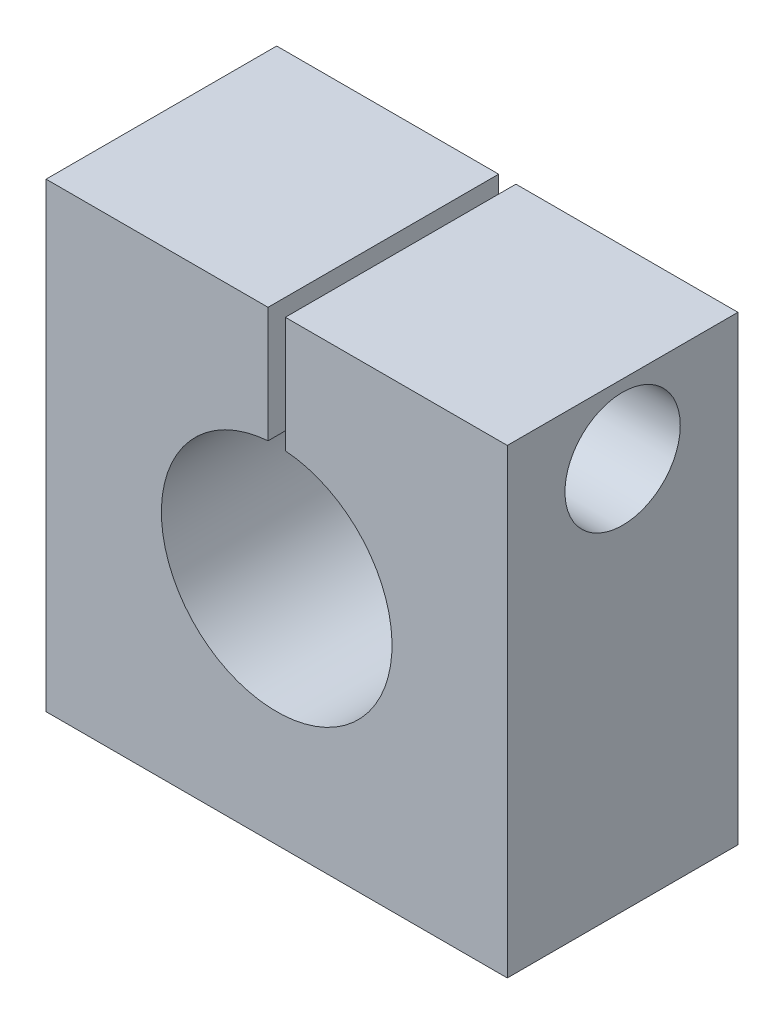
ISO-10303-21;
HEADER;
FILE_DESCRIPTION(('STEP AP214'),'2;1');
FILE_NAME('part.step','',(''),(''),'','','');
FILE_SCHEMA(('AUTOMOTIVE_DESIGN { 1 0 10303 214 1 1 1 1 }'));
ENDSEC;
DATA;
#1=APPLICATION_CONTEXT('core data for automotive mechanical design processes');
#2=APPLICATION_PROTOCOL_DEFINITION('international standard','automotive_design',2000,#1);
#3=PRODUCT_CONTEXT('',#1,'mechanical');
#4=PRODUCT('Part','Part','',(#3));
#5=PRODUCT_RELATED_PRODUCT_CATEGORY('part','',(#4));
#6=PRODUCT_DEFINITION_FORMATION('','',#4);
#7=PRODUCT_DEFINITION_CONTEXT('part definition',#1,'design');
#8=PRODUCT_DEFINITION('design','',#6,#7);
#9=PRODUCT_DEFINITION_SHAPE('','',#8);
#10=(LENGTH_UNIT() NAMED_UNIT(*) SI_UNIT(.MILLI.,.METRE.));
#11=(NAMED_UNIT(*) PLANE_ANGLE_UNIT() SI_UNIT($,.RADIAN.));
#12=(NAMED_UNIT(*) SI_UNIT($,.STERADIAN.) SOLID_ANGLE_UNIT());
#13=UNCERTAINTY_MEASURE_WITH_UNIT(LENGTH_MEASURE(1.E-05),#10,'distance_accuracy_value','');
#14=(GEOMETRIC_REPRESENTATION_CONTEXT(3) GLOBAL_UNCERTAINTY_ASSIGNED_CONTEXT((#13)) GLOBAL_UNIT_ASSIGNED_CONTEXT((#10,
#11,#12)) REPRESENTATION_CONTEXT('',''));
#15=CARTESIAN_POINT('',(0.,0.,0.));
#16=DIRECTION('',(0.,0.,1.));
#17=DIRECTION('',(1.,0.,0.));
#18=AXIS2_PLACEMENT_3D('',#15,#16,#17);
#19=CARTESIAN_POINT('',(-9.99999999999999,39.,10.));
#20=DIRECTION('',(1.,0.,0.));
#21=DIRECTION('',(0.,0.,-1.));
#22=AXIS2_PLACEMENT_3D('',#19,#20,#21);
#23=CYLINDRICAL_SURFACE('',#22,3.);
#24=CARTESIAN_POINT('',(0.750000000000001,39.,10.));
#25=DIRECTION('',(1.,0.,0.));
#26=DIRECTION('',(0.,1.,0.));
#27=AXIS2_PLACEMENT_3D('',#24,#25,#26);
#28=CIRCLE('',#27,3.);
#29=CARTESIAN_POINT('',(0.750000000000001,42.,10.));
#30=VERTEX_POINT('',#29);
#31=EDGE_CURVE('E137',#30,#30,#28,.T.);
#32=ORIENTED_EDGE('',*,*,#31,.F.);
#33=EDGE_LOOP('',(#32));
#34=FACE_BOUND('',#33,.T.);
#35=CARTESIAN_POINT('',(10.,39.,10.));
#36=DIRECTION('',(1.,0.,0.));
#37=DIRECTION('',(0.,0.,-1.));
#38=AXIS2_PLACEMENT_3D('',#35,#36,#37);
#39=CIRCLE('',#38,3.);
#40=CARTESIAN_POINT('',(10.,39.,7.));
#41=VERTEX_POINT('',#40);
#42=EDGE_CURVE('E39',#41,#41,#39,.F.);
#43=ORIENTED_EDGE('',*,*,#42,.F.);
#44=EDGE_LOOP('',(#43));
#45=FACE_BOUND('',#44,.T.);
#46=ADVANCED_FACE('F35',(#34,#45),#23,.F.);
#47=CARTESIAN_POINT('',(0.,25.,20.));
#48=DIRECTION('',(0.,0.,-1.));
#49=DIRECTION('',(-1.,0.,0.));
#50=AXIS2_PLACEMENT_3D('',#47,#48,#49);
#51=CYLINDRICAL_SURFACE('',#50,10.);
#52=CARTESIAN_POINT('',(0.,25.,0.));
#53=DIRECTION('',(0.,0.,1.));
#54=DIRECTION('',(1.,0.,0.));
#55=AXIS2_PLACEMENT_3D('',#52,#53,#54);
#56=CIRCLE('',#55,10.);
#57=CARTESIAN_POINT('',(-0.75,34.9718353375896,0.));
#58=VERTEX_POINT('',#57);
#59=CARTESIAN_POINT('',(0.75,34.9718353375896,0.));
#60=VERTEX_POINT('',#59);
#61=EDGE_CURVE('E144',#58,#60,#56,.T.);
#62=ORIENTED_EDGE('',*,*,#61,.F.);
#63=DIRECTION('',(0.,0.,-1.));
#64=VECTOR('',#63,1.);
#65=CARTESIAN_POINT('',(-0.75,34.9718353375896,20.));
#66=LINE('',#65,#64);
#67=CARTESIAN_POINT('',(-0.75,34.9718353375896,20.));
#68=VERTEX_POINT('',#67);
#69=EDGE_CURVE('E11',#68,#58,#66,.T.);
#70=ORIENTED_EDGE('',*,*,#69,.F.);
#71=CARTESIAN_POINT('',(0.,25.,20.));
#72=DIRECTION('',(0.,0.,1.));
#73=DIRECTION('',(1.,0.,0.));
#74=AXIS2_PLACEMENT_3D('',#71,#72,#73);
#75=CIRCLE('',#74,10.);
#76=CARTESIAN_POINT('',(0.75,34.9718353375896,20.));
#77=VERTEX_POINT('',#76);
#78=EDGE_CURVE('E156',#68,#77,#75,.T.);
#79=ORIENTED_EDGE('',*,*,#78,.T.);
#80=DIRECTION('',(0.,0.,-1.));
#81=VECTOR('',#80,1.);
#82=CARTESIAN_POINT('',(0.75,34.9718353375896,20.));
#83=LINE('',#82,#81);
#84=EDGE_CURVE('E87',#77,#60,#83,.T.);
#85=ORIENTED_EDGE('',*,*,#84,.T.);
#86=EDGE_LOOP('',(#62,#70,#79,#85));
#87=FACE_BOUND('',#86,.T.);
#88=ADVANCED_FACE('F37',(#87),#51,.F.);
#89=CARTESIAN_POINT('',(-0.749999999999999,0.,20.));
#90=DIRECTION('',(-1.,0.,0.));
#91=DIRECTION('',(0.,-1.,0.));
#92=AXIS2_PLACEMENT_3D('',#89,#90,#91);
#93=PLANE('',#92);
#94=CARTESIAN_POINT('',(-0.750000000000001,39.,10.));
#95=DIRECTION('',(-1.,0.,0.));
#96=DIRECTION('',(0.,-1.,0.));
#97=AXIS2_PLACEMENT_3D('',#94,#95,#96);
#98=CIRCLE('',#97,3.);
#99=CARTESIAN_POINT('',(-0.750000000000001,36.,10.));
#100=VERTEX_POINT('',#99);
#101=EDGE_CURVE('E139',#100,#100,#98,.T.);
#102=ORIENTED_EDGE('',*,*,#101,.T.);
#103=EDGE_LOOP('',(#102));
#104=FACE_BOUND('',#103,.T.);
#105=DIRECTION('',(0.,1.,0.));
#106=VECTOR('',#105,1.);
#107=CARTESIAN_POINT('',(-0.749999999999999,0.,0.));
#108=LINE('',#107,#106);
#109=CARTESIAN_POINT('',(-0.75,45.,0.));
#110=VERTEX_POINT('',#109);
#111=EDGE_CURVE('E169',#58,#110,#108,.T.);
#112=ORIENTED_EDGE('',*,*,#111,.T.);
#113=DIRECTION('',(0.,0.,-1.));
#114=VECTOR('',#113,1.);
#115=CARTESIAN_POINT('',(-0.75,45.,20.));
#116=LINE('',#115,#114);
#117=CARTESIAN_POINT('',(-0.75,45.,20.));
#118=VERTEX_POINT('',#117);
#119=EDGE_CURVE('E44',#118,#110,#116,.T.);
#120=ORIENTED_EDGE('',*,*,#119,.F.);
#121=DIRECTION('',(0.,1.,0.));
#122=VECTOR('',#121,1.);
#123=CARTESIAN_POINT('',(-0.749999999999999,0.,20.));
#124=LINE('',#123,#122);
#125=EDGE_CURVE('E158',#68,#118,#124,.T.);
#126=ORIENTED_EDGE('',*,*,#125,.F.);
#127=ORIENTED_EDGE('',*,*,#69,.T.);
#128=EDGE_LOOP('',(#112,#120,#126,#127));
#129=FACE_BOUND('',#128,.T.);
#130=ADVANCED_FACE('F187',(#104,#129),#93,.F.);
#131=CARTESIAN_POINT('',(0.,45.,20.));
#132=DIRECTION('',(0.,-1.,0.));
#133=DIRECTION('',(0.,0.,-1.));
#134=AXIS2_PLACEMENT_3D('',#131,#132,#133);
#135=PLANE('',#134);
#136=DIRECTION('',(-1.,0.,0.));
#137=VECTOR('',#136,1.);
#138=CARTESIAN_POINT('',(0.,45.,0.));
#139=LINE('',#138,#137);
#140=CARTESIAN_POINT('',(-20.,45.,0.));
#141=VERTEX_POINT('',#140);
#142=EDGE_CURVE('E172',#110,#141,#139,.T.);
#143=ORIENTED_EDGE('',*,*,#142,.T.);
#144=DIRECTION('',(0.,0.,-1.));
#145=VECTOR('',#144,1.);
#146=CARTESIAN_POINT('',(-20.,45.,20.));
#147=LINE('',#146,#145);
#148=CARTESIAN_POINT('',(-20.,45.,20.));
#149=VERTEX_POINT('',#148);
#150=EDGE_CURVE('E129',#149,#141,#147,.T.);
#151=ORIENTED_EDGE('',*,*,#150,.F.);
#152=DIRECTION('',(-1.,0.,0.));
#153=VECTOR('',#152,1.);
#154=CARTESIAN_POINT('',(0.,45.,20.));
#155=LINE('',#154,#153);
#156=EDGE_CURVE('E162',#118,#149,#155,.T.);
#157=ORIENTED_EDGE('',*,*,#156,.F.);
#158=ORIENTED_EDGE('',*,*,#119,.T.);
#159=EDGE_LOOP('',(#143,#151,#157,#158));
#160=FACE_BOUND('',#159,.T.);
#161=ADVANCED_FACE('F192',(#160),#135,.F.);
#162=CARTESIAN_POINT('',(-20.,0.,20.));
#163=DIRECTION('',(1.,0.,0.));
#164=DIRECTION('',(0.,0.,-1.));
#165=AXIS2_PLACEMENT_3D('',#162,#163,#164);
#166=PLANE('',#165);
#167=DIRECTION('',(0.,-1.,0.));
#168=VECTOR('',#167,1.);
#169=CARTESIAN_POINT('',(-20.,0.,0.));
#170=LINE('',#169,#168);
#171=CARTESIAN_POINT('',(-20.,4.99999999999999,0.));
#172=VERTEX_POINT('',#171);
#173=EDGE_CURVE('E175',#141,#172,#170,.T.);
#174=ORIENTED_EDGE('',*,*,#173,.T.);
#175=DIRECTION('',(0.,0.,1.));
#176=VECTOR('',#175,1.);
#177=CARTESIAN_POINT('',(-20.,4.99999999999999,0.));
#178=LINE('',#177,#176);
#179=CARTESIAN_POINT('',(-20.,4.99999999999999,20.));
#180=VERTEX_POINT('',#179);
#181=EDGE_CURVE('E52',#172,#180,#178,.T.);
#182=ORIENTED_EDGE('',*,*,#181,.T.);
#183=DIRECTION('',(0.,-1.,0.));
#184=VECTOR('',#183,1.);
#185=CARTESIAN_POINT('',(-20.,0.,20.));
#186=LINE('',#185,#184);
#187=EDGE_CURVE('E115',#149,#180,#186,.T.);
#188=ORIENTED_EDGE('',*,*,#187,.F.);
#189=ORIENTED_EDGE('',*,*,#150,.T.);
#190=EDGE_LOOP('',(#174,#182,#188,#189));
#191=FACE_BOUND('',#190,.T.);
#192=ADVANCED_FACE('F219',(#191),#166,.F.);
#193=CARTESIAN_POINT('',(20.,0.,20.));
#194=DIRECTION('',(-1.,0.,0.));
#195=DIRECTION('',(0.,0.,1.));
#196=AXIS2_PLACEMENT_3D('',#193,#194,#195);
#197=PLANE('',#196);
#198=CARTESIAN_POINT('',(20.,39.,10.));
#199=DIRECTION('',(1.,0.,0.));
#200=DIRECTION('',(0.,0.,-1.));
#201=AXIS2_PLACEMENT_3D('',#198,#199,#200);
#202=CIRCLE('',#201,5.);
#203=CARTESIAN_POINT('',(20.,39.,5.));
#204=VERTEX_POINT('',#203);
#205=EDGE_CURVE('E153',#204,#204,#202,.T.);
#206=ORIENTED_EDGE('',*,*,#205,.F.);
#207=EDGE_LOOP('',(#206));
#208=FACE_BOUND('',#207,.T.);
#209=DIRECTION('',(0.,1.,0.));
#210=VECTOR('',#209,1.);
#211=CARTESIAN_POINT('',(20.,0.,20.));
#212=LINE('',#211,#210);
#213=CARTESIAN_POINT('',(20.,4.99999999999999,20.));
#214=VERTEX_POINT('',#213);
#215=CARTESIAN_POINT('',(20.,45.,20.));
#216=VERTEX_POINT('',#215);
#217=EDGE_CURVE('E104',#214,#216,#212,.T.);
#218=ORIENTED_EDGE('',*,*,#217,.F.);
#219=DIRECTION('',(0.,0.,1.));
#220=VECTOR('',#219,1.);
#221=CARTESIAN_POINT('',(20.,4.99999999999999,0.));
#222=LINE('',#221,#220);
#223=CARTESIAN_POINT('',(20.,4.99999999999999,0.));
#224=VERTEX_POINT('',#223);
#225=EDGE_CURVE('E220',#224,#214,#222,.T.);
#226=ORIENTED_EDGE('',*,*,#225,.F.);
#227=DIRECTION('',(0.,1.,0.));
#228=VECTOR('',#227,1.);
#229=CARTESIAN_POINT('',(20.,0.,0.));
#230=LINE('',#229,#228);
#231=CARTESIAN_POINT('',(20.,45.,0.));
#232=VERTEX_POINT('',#231);
#233=EDGE_CURVE('E127',#224,#232,#230,.T.);
#234=ORIENTED_EDGE('',*,*,#233,.T.);
#235=DIRECTION('',(0.,0.,-1.));
#236=VECTOR('',#235,1.);
#237=CARTESIAN_POINT('',(20.,45.,20.));
#238=LINE('',#237,#236);
#239=EDGE_CURVE('E121',#216,#232,#238,.T.);
#240=ORIENTED_EDGE('',*,*,#239,.F.);
#241=EDGE_LOOP('',(#218,#226,#234,#240));
#242=FACE_BOUND('',#241,.T.);
#243=ADVANCED_FACE('F125',(#208,#242),#197,.F.);
#244=CARTESIAN_POINT('',(0.,45.,20.));
#245=DIRECTION('',(0.,-1.,0.));
#246=DIRECTION('',(0.,0.,-1.));
#247=AXIS2_PLACEMENT_3D('',#244,#245,#246);
#248=PLANE('',#247);
#249=DIRECTION('',(-1.,0.,0.));
#250=VECTOR('',#249,1.);
#251=CARTESIAN_POINT('',(0.,45.,0.));
#252=LINE('',#251,#250);
#253=CARTESIAN_POINT('',(0.75,45.,0.));
#254=VERTEX_POINT('',#253);
#255=EDGE_CURVE('E179',#232,#254,#252,.T.);
#256=ORIENTED_EDGE('',*,*,#255,.T.);
#257=DIRECTION('',(0.,0.,-1.));
#258=VECTOR('',#257,1.);
#259=CARTESIAN_POINT('',(0.75,45.,20.));
#260=LINE('',#259,#258);
#261=CARTESIAN_POINT('',(0.75,45.,20.));
#262=VERTEX_POINT('',#261);
#263=EDGE_CURVE('E123',#262,#254,#260,.T.);
#264=ORIENTED_EDGE('',*,*,#263,.F.);
#265=DIRECTION('',(-1.,0.,0.));
#266=VECTOR('',#265,1.);
#267=CARTESIAN_POINT('',(0.,45.,20.));
#268=LINE('',#267,#266);
#269=EDGE_CURVE('E107',#216,#262,#268,.T.);
#270=ORIENTED_EDGE('',*,*,#269,.F.);
#271=ORIENTED_EDGE('',*,*,#239,.T.);
#272=EDGE_LOOP('',(#256,#264,#270,#271));
#273=FACE_BOUND('',#272,.T.);
#274=ADVANCED_FACE('F120',(#273),#248,.F.);
#275=CARTESIAN_POINT('',(0.749999999999999,0.,20.));
#276=DIRECTION('',(1.,0.,0.));
#277=DIRECTION('',(0.,1.,0.));
#278=AXIS2_PLACEMENT_3D('',#275,#276,#277);
#279=PLANE('',#278);
#280=ORIENTED_EDGE('',*,*,#31,.T.);
#281=EDGE_LOOP('',(#280));
#282=FACE_BOUND('',#281,.T.);
#283=DIRECTION('',(0.,-1.,0.));
#284=VECTOR('',#283,1.);
#285=CARTESIAN_POINT('',(0.749999999999999,0.,0.));
#286=LINE('',#285,#284);
#287=EDGE_CURVE('E159',#254,#60,#286,.T.);
#288=ORIENTED_EDGE('',*,*,#287,.T.);
#289=ORIENTED_EDGE('',*,*,#84,.F.);
#290=DIRECTION('',(0.,-1.,0.));
#291=VECTOR('',#290,1.);
#292=CARTESIAN_POINT('',(0.749999999999999,0.,20.));
#293=LINE('',#292,#291);
#294=EDGE_CURVE('E61',#262,#77,#293,.T.);
#295=ORIENTED_EDGE('',*,*,#294,.F.);
#296=ORIENTED_EDGE('',*,*,#263,.T.);
#297=EDGE_LOOP('',(#288,#289,#295,#296));
#298=FACE_BOUND('',#297,.T.);
#299=ADVANCED_FACE('F182',(#282,#298),#279,.F.);
#300=CARTESIAN_POINT('',(0.,0.,20.));
#301=DIRECTION('',(0.,0.,1.));
#302=DIRECTION('',(1.,0.,0.));
#303=AXIS2_PLACEMENT_3D('',#300,#301,#302);
#304=PLANE('',#303);
#305=DIRECTION('',(-1.,0.,0.));
#306=VECTOR('',#305,1.);
#307=CARTESIAN_POINT('',(-20.,4.99999999999999,20.));
#308=LINE('',#307,#306);
#309=EDGE_CURVE('E111',#214,#180,#308,.T.);
#310=ORIENTED_EDGE('',*,*,#309,.F.);
#311=ORIENTED_EDGE('',*,*,#217,.T.);
#312=ORIENTED_EDGE('',*,*,#269,.T.);
#313=ORIENTED_EDGE('',*,*,#294,.T.);
#314=ORIENTED_EDGE('',*,*,#78,.F.);
#315=ORIENTED_EDGE('',*,*,#125,.T.);
#316=ORIENTED_EDGE('',*,*,#156,.T.);
#317=ORIENTED_EDGE('',*,*,#187,.T.);
#318=EDGE_LOOP('',(#310,#311,#312,#313,#314,#315,#316,#317));
#319=FACE_BOUND('',#318,.T.);
#320=ADVANCED_FACE('F106',(#319),#304,.T.);
#321=CARTESIAN_POINT('',(0.,0.,0.));
#322=DIRECTION('',(0.,0.,1.));
#323=DIRECTION('',(1.,0.,0.));
#324=AXIS2_PLACEMENT_3D('',#321,#322,#323);
#325=PLANE('',#324);
#326=ORIENTED_EDGE('',*,*,#233,.F.);
#327=DIRECTION('',(-1.,0.,0.));
#328=VECTOR('',#327,1.);
#329=CARTESIAN_POINT('',(-20.,4.99999999999999,0.));
#330=LINE('',#329,#328);
#331=EDGE_CURVE('E224',#224,#172,#330,.T.);
#332=ORIENTED_EDGE('',*,*,#331,.T.);
#333=ORIENTED_EDGE('',*,*,#173,.F.);
#334=ORIENTED_EDGE('',*,*,#142,.F.);
#335=ORIENTED_EDGE('',*,*,#111,.F.);
#336=ORIENTED_EDGE('',*,*,#61,.T.);
#337=ORIENTED_EDGE('',*,*,#287,.F.);
#338=ORIENTED_EDGE('',*,*,#255,.F.);
#339=EDGE_LOOP('',(#326,#332,#333,#334,#335,#336,#337,#338));
#340=FACE_BOUND('',#339,.T.);
#341=ADVANCED_FACE('F185',(#340),#325,.F.);
#342=CARTESIAN_POINT('',(-9.99999999999999,39.,10.));
#343=DIRECTION('',(1.,0.,0.));
#344=DIRECTION('',(0.,0.,-1.));
#345=AXIS2_PLACEMENT_3D('',#342,#343,#344);
#346=CIRCLE('',#345,3.);
#347=CARTESIAN_POINT('',(-9.99999999999999,39.,7.));
#348=VERTEX_POINT('',#347);
#349=EDGE_CURVE('E140',#348,#348,#346,.T.);
#350=ORIENTED_EDGE('',*,*,#349,.F.);
#351=EDGE_LOOP('',(#350));
#352=FACE_BOUND('',#351,.T.);
#353=ORIENTED_EDGE('',*,*,#101,.F.);
#354=EDGE_LOOP('',(#353));
#355=FACE_BOUND('',#354,.T.);
#356=ADVANCED_FACE('F196',(#352,#355),#23,.F.);
#357=CARTESIAN_POINT('',(-9.99999999999999,39.,10.));
#358=DIRECTION('',(1.,0.,0.));
#359=DIRECTION('',(0.,0.,-1.));
#360=AXIS2_PLACEMENT_3D('',#357,#358,#359);
#361=PLANE('',#360);
#362=ORIENTED_EDGE('',*,*,#349,.T.);
#363=EDGE_LOOP('',(#362));
#364=FACE_BOUND('',#363,.T.);
#365=ADVANCED_FACE('F203',(#364),#361,.T.);
#366=CARTESIAN_POINT('',(10.,39.,10.));
#367=DIRECTION('',(1.,0.,0.));
#368=DIRECTION('',(0.,0.,-1.));
#369=AXIS2_PLACEMENT_3D('',#366,#367,#368);
#370=PLANE('',#369);
#371=CARTESIAN_POINT('',(10.,39.,10.));
#372=DIRECTION('',(1.,0.,0.));
#373=DIRECTION('',(0.,0.,-1.));
#374=AXIS2_PLACEMENT_3D('',#371,#372,#373);
#375=CIRCLE('',#374,5.);
#376=CARTESIAN_POINT('',(10.,39.,5.));
#377=VERTEX_POINT('',#376);
#378=EDGE_CURVE('E151',#377,#377,#375,.T.);
#379=ORIENTED_EDGE('',*,*,#378,.T.);
#380=EDGE_LOOP('',(#379));
#381=FACE_BOUND('',#380,.T.);
#382=ORIENTED_EDGE('',*,*,#42,.T.);
#383=EDGE_LOOP('',(#382));
#384=FACE_BOUND('',#383,.T.);
#385=ADVANCED_FACE('F209',(#381,#384),#370,.T.);
#386=CARTESIAN_POINT('',(10.,39.,10.));
#387=DIRECTION('',(1.,0.,0.));
#388=DIRECTION('',(0.,0.,-1.));
#389=AXIS2_PLACEMENT_3D('',#386,#387,#388);
#390=CYLINDRICAL_SURFACE('',#389,5.);
#391=ORIENTED_EDGE('',*,*,#378,.F.);
#392=EDGE_LOOP('',(#391));
#393=FACE_BOUND('',#392,.T.);
#394=ORIENTED_EDGE('',*,*,#205,.T.);
#395=EDGE_LOOP('',(#394));
#396=FACE_BOUND('',#395,.T.);
#397=ADVANCED_FACE('F233',(#393,#396),#390,.F.);
#398=CARTESIAN_POINT('',(-20.,4.99999999999999,0.));
#399=DIRECTION('',(0.,1.,0.));
#400=DIRECTION('',(0.,0.,1.));
#401=AXIS2_PLACEMENT_3D('',#398,#399,#400);
#402=PLANE('',#401);
#403=CARTESIAN_POINT('',(10.,4.99999999999999,10.));
#404=DIRECTION('',(0.,-1.,0.));
#405=DIRECTION('',(0.,0.,-1.));
#406=AXIS2_PLACEMENT_3D('',#403,#404,#405);
#407=CIRCLE('',#406,4.);
#408=CARTESIAN_POINT('',(10.,4.99999999999999,6.));
#409=VERTEX_POINT('',#408);
#410=EDGE_CURVE('E369',#409,#409,#407,.T.);
#411=ORIENTED_EDGE('',*,*,#410,.F.);
#412=EDGE_LOOP('',(#411));
#413=FACE_BOUND('',#412,.T.);
#414=CARTESIAN_POINT('',(-10.,4.99999999999999,10.));
#415=DIRECTION('',(0.,-1.,0.));
#416=DIRECTION('',(0.,0.,-1.));
#417=AXIS2_PLACEMENT_3D('',#414,#415,#416);
#418=CIRCLE('',#417,4.);
#419=CARTESIAN_POINT('',(-10.,4.99999999999999,6.));
#420=VERTEX_POINT('',#419);
#421=EDGE_CURVE('E368',#420,#420,#418,.T.);
#422=ORIENTED_EDGE('',*,*,#421,.F.);
#423=EDGE_LOOP('',(#422));
#424=FACE_BOUND('',#423,.T.);
#425=ORIENTED_EDGE('',*,*,#309,.T.);
#426=ORIENTED_EDGE('',*,*,#181,.F.);
#427=ORIENTED_EDGE('',*,*,#331,.F.);
#428=ORIENTED_EDGE('',*,*,#225,.T.);
#429=EDGE_LOOP('',(#425,#426,#427,#428));
#430=FACE_BOUND('',#429,.T.);
#431=ADVANCED_FACE('F236',(#413,#424,#430),#402,.F.);
#432=CARTESIAN_POINT('',(-10.,15.,10.));
#433=DIRECTION('',(0.,-1.,0.));
#434=DIRECTION('',(0.,0.,-1.));
#435=AXIS2_PLACEMENT_3D('',#432,#433,#434);
#436=CYLINDRICAL_SURFACE('',#435,4.);
#437=CARTESIAN_POINT('',(-10.,15.,10.));
#438=DIRECTION('',(0.,-1.,0.));
#439=DIRECTION('',(0.,0.,-1.));
#440=AXIS2_PLACEMENT_3D('',#437,#438,#439);
#441=CIRCLE('',#440,4.);
#442=CARTESIAN_POINT('',(-10.,15.,6.));
#443=VERTEX_POINT('',#442);
#444=EDGE_CURVE('E372',#443,#443,#441,.T.);
#445=ORIENTED_EDGE('',*,*,#444,.F.);
#446=EDGE_LOOP('',(#445));
#447=FACE_BOUND('',#446,.T.);
#448=ORIENTED_EDGE('',*,*,#421,.T.);
#449=EDGE_LOOP('',(#448));
#450=FACE_BOUND('',#449,.T.);
#451=ADVANCED_FACE('F295',(#447,#450),#436,.F.);
#452=CARTESIAN_POINT('',(-10.,15.,10.));
#453=DIRECTION('',(0.,-1.,0.));
#454=DIRECTION('',(0.,0.,-1.));
#455=AXIS2_PLACEMENT_3D('',#452,#453,#454);
#456=PLANE('',#455);
#457=ORIENTED_EDGE('',*,*,#444,.T.);
#458=EDGE_LOOP('',(#457));
#459=FACE_BOUND('',#458,.T.);
#460=ADVANCED_FACE('F306',(#459),#456,.T.);
#461=CARTESIAN_POINT('',(10.,15.,10.));
#462=DIRECTION('',(0.,-1.,0.));
#463=DIRECTION('',(0.,0.,-1.));
#464=AXIS2_PLACEMENT_3D('',#461,#462,#463);
#465=CYLINDRICAL_SURFACE('',#464,4.);
#466=CARTESIAN_POINT('',(10.,15.,10.));
#467=DIRECTION('',(0.,-1.,0.));
#468=DIRECTION('',(0.,0.,-1.));
#469=AXIS2_PLACEMENT_3D('',#466,#467,#468);
#470=CIRCLE('',#469,4.);
#471=CARTESIAN_POINT('',(10.,15.,6.));
#472=VERTEX_POINT('',#471);
#473=EDGE_CURVE('E367',#472,#472,#470,.T.);
#474=ORIENTED_EDGE('',*,*,#473,.F.);
#475=EDGE_LOOP('',(#474));
#476=FACE_BOUND('',#475,.T.);
#477=ORIENTED_EDGE('',*,*,#410,.T.);
#478=EDGE_LOOP('',(#477));
#479=FACE_BOUND('',#478,.T.);
#480=ADVANCED_FACE('F316',(#476,#479),#465,.F.);
#481=CARTESIAN_POINT('',(10.,15.,10.));
#482=DIRECTION('',(0.,-1.,0.));
#483=DIRECTION('',(0.,0.,-1.));
#484=AXIS2_PLACEMENT_3D('',#481,#482,#483);
#485=PLANE('',#484);
#486=ORIENTED_EDGE('',*,*,#473,.T.);
#487=EDGE_LOOP('',(#486));
#488=FACE_BOUND('',#487,.T.);
#489=ADVANCED_FACE('F326',(#488),#485,.T.);
#490=CLOSED_SHELL('',(#46,#88,#130,#161,#192,#243,#274,#299,#320,#341,#356,#365,#385,#397,#431,
#451,#460,#480,#489));
#491=MANIFOLD_SOLID_BREP('B2',#490);
#492=ADVANCED_BREP_SHAPE_REPRESENTATION('',(#18,#491),#14);
#493=SHAPE_DEFINITION_REPRESENTATION(#9,#492);
ENDSEC;
END-ISO-10303-21;
